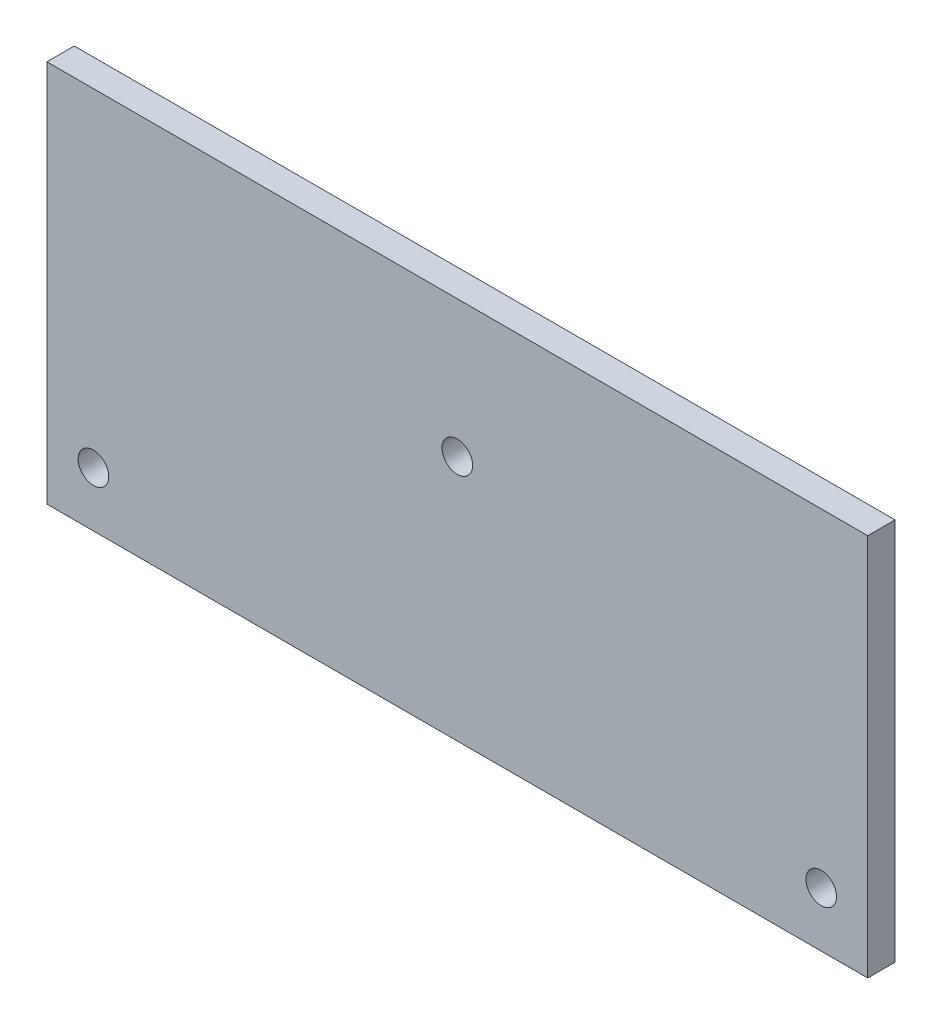
ISO-10303-21;
HEADER;
FILE_DESCRIPTION(('STEP AP214'),'2;1');
FILE_NAME('part.step','',(''),(''),'','','');
FILE_SCHEMA(('AUTOMOTIVE_DESIGN { 1 0 10303 214 1 1 1 1 }'));
ENDSEC;
DATA;
#1=APPLICATION_CONTEXT('core data for automotive mechanical design processes');
#2=APPLICATION_PROTOCOL_DEFINITION('international standard','automotive_design',2000,#1);
#3=PRODUCT_CONTEXT('',#1,'mechanical');
#4=PRODUCT('Part','Part','',(#3));
#5=PRODUCT_RELATED_PRODUCT_CATEGORY('part','',(#4));
#6=PRODUCT_DEFINITION_FORMATION('','',#4);
#7=PRODUCT_DEFINITION_CONTEXT('part definition',#1,'design');
#8=PRODUCT_DEFINITION('design','',#6,#7);
#9=PRODUCT_DEFINITION_SHAPE('','',#8);
#10=(LENGTH_UNIT() NAMED_UNIT(*) SI_UNIT(.MILLI.,.METRE.));
#11=(NAMED_UNIT(*) PLANE_ANGLE_UNIT() SI_UNIT($,.RADIAN.));
#12=(NAMED_UNIT(*) SI_UNIT($,.STERADIAN.) SOLID_ANGLE_UNIT());
#13=UNCERTAINTY_MEASURE_WITH_UNIT(LENGTH_MEASURE(1.E-05),#10,'distance_accuracy_value','');
#14=(GEOMETRIC_REPRESENTATION_CONTEXT(3) GLOBAL_UNCERTAINTY_ASSIGNED_CONTEXT((#13)) GLOBAL_UNIT_ASSIGNED_CONTEXT((#10,
#11,#12)) REPRESENTATION_CONTEXT('',''));
#15=CARTESIAN_POINT('',(0.,0.,0.));
#16=DIRECTION('',(0.,0.,1.));
#17=DIRECTION('',(1.,0.,0.));
#18=AXIS2_PLACEMENT_3D('',#15,#16,#17);
#19=CARTESIAN_POINT('',(0.,0.,5.));
#20=DIRECTION('',(0.,0.,1.));
#21=DIRECTION('',(1.,0.,0.));
#22=AXIS2_PLACEMENT_3D('',#19,#20,#21);
#23=PLANE('',#22);
#24=CARTESIAN_POINT('',(8.50000000000001,-60.,5.));
#25=DIRECTION('',(0.,0.,1.));
#26=DIRECTION('',(1.,0.,0.));
#27=AXIS2_PLACEMENT_3D('',#24,#25,#26);
#28=CIRCLE('',#27,2.8);
#29=CARTESIAN_POINT('',(11.3,-60.,5.));
#30=VERTEX_POINT('',#29);
#31=EDGE_CURVE('E134',#30,#30,#28,.T.);
#32=ORIENTED_EDGE('',*,*,#31,.F.);
#33=EDGE_LOOP('',(#32));
#34=FACE_BOUND('',#33,.T.);
#35=DIRECTION('',(0.,-1.,0.));
#36=VECTOR('',#35,1.);
#37=CARTESIAN_POINT('',(0.,0.,5.));
#38=LINE('',#37,#36);
#39=CARTESIAN_POINT('',(0.,0.,5.));
#40=VERTEX_POINT('',#39);
#41=CARTESIAN_POINT('',(0.,-70.,5.));
#42=VERTEX_POINT('',#41);
#43=EDGE_CURVE('E92',#40,#42,#38,.T.);
#44=ORIENTED_EDGE('',*,*,#43,.T.);
#45=DIRECTION('',(1.,0.,0.));
#46=VECTOR('',#45,1.);
#47=CARTESIAN_POINT('',(0.,-70.,5.));
#48=LINE('',#47,#46);
#49=CARTESIAN_POINT('',(150.,-70.,5.));
#50=VERTEX_POINT('',#49);
#51=EDGE_CURVE('E87',#42,#50,#48,.T.);
#52=ORIENTED_EDGE('',*,*,#51,.T.);
#53=DIRECTION('',(0.,1.,0.));
#54=VECTOR('',#53,1.);
#55=CARTESIAN_POINT('',(150.,0.,5.));
#56=LINE('',#55,#54);
#57=CARTESIAN_POINT('',(150.,0.,5.));
#58=VERTEX_POINT('',#57);
#59=EDGE_CURVE('E90',#50,#58,#56,.T.);
#60=ORIENTED_EDGE('',*,*,#59,.T.);
#61=DIRECTION('',(-1.,0.,0.));
#62=VECTOR('',#61,1.);
#63=CARTESIAN_POINT('',(0.,0.,5.));
#64=LINE('',#63,#62);
#65=EDGE_CURVE('E57',#58,#40,#64,.T.);
#66=ORIENTED_EDGE('',*,*,#65,.T.);
#67=EDGE_LOOP('',(#44,#52,#60,#66));
#68=FACE_BOUND('',#67,.T.);
#69=CARTESIAN_POINT('',(75.,-25.,5.));
#70=DIRECTION('',(0.,0.,1.));
#71=DIRECTION('',(1.,0.,0.));
#72=AXIS2_PLACEMENT_3D('',#69,#70,#71);
#73=CIRCLE('',#72,2.80000000000001);
#74=CARTESIAN_POINT('',(77.8,-25.,5.));
#75=VERTEX_POINT('',#74);
#76=EDGE_CURVE('E112',#75,#75,#73,.T.);
#77=ORIENTED_EDGE('',*,*,#76,.F.);
#78=EDGE_LOOP('',(#77));
#79=FACE_BOUND('',#78,.T.);
#80=CARTESIAN_POINT('',(141.5,-60.,5.));
#81=DIRECTION('',(0.,0.,1.));
#82=DIRECTION('',(1.,0.,0.));
#83=AXIS2_PLACEMENT_3D('',#80,#81,#82);
#84=CIRCLE('',#83,2.8);
#85=CARTESIAN_POINT('',(144.3,-60.,5.));
#86=VERTEX_POINT('',#85);
#87=EDGE_CURVE('E142',#86,#86,#84,.T.);
#88=ORIENTED_EDGE('',*,*,#87,.F.);
#89=EDGE_LOOP('',(#88));
#90=FACE_BOUND('',#89,.T.);
#91=ADVANCED_FACE('F39',(#34,#68,#79,#90),#23,.T.);
#92=CARTESIAN_POINT('',(0.,0.,0.));
#93=DIRECTION('',(0.,0.,1.));
#94=DIRECTION('',(1.,0.,0.));
#95=AXIS2_PLACEMENT_3D('',#92,#93,#94);
#96=PLANE('',#95);
#97=DIRECTION('',(0.,-1.,0.));
#98=VECTOR('',#97,1.);
#99=CARTESIAN_POINT('',(0.,0.,0.));
#100=LINE('',#99,#98);
#101=CARTESIAN_POINT('',(0.,0.,0.));
#102=VERTEX_POINT('',#101);
#103=CARTESIAN_POINT('',(0.,-70.,0.));
#104=VERTEX_POINT('',#103);
#105=EDGE_CURVE('E108',#102,#104,#100,.T.);
#106=ORIENTED_EDGE('',*,*,#105,.F.);
#107=DIRECTION('',(-1.,0.,0.));
#108=VECTOR('',#107,1.);
#109=CARTESIAN_POINT('',(0.,0.,0.));
#110=LINE('',#109,#108);
#111=CARTESIAN_POINT('',(150.,0.,0.));
#112=VERTEX_POINT('',#111);
#113=EDGE_CURVE('E80',#112,#102,#110,.T.);
#114=ORIENTED_EDGE('',*,*,#113,.F.);
#115=DIRECTION('',(0.,1.,0.));
#116=VECTOR('',#115,1.);
#117=CARTESIAN_POINT('',(150.,0.,0.));
#118=LINE('',#117,#116);
#119=CARTESIAN_POINT('',(150.,-70.,0.));
#120=VERTEX_POINT('',#119);
#121=EDGE_CURVE('E74',#120,#112,#118,.T.);
#122=ORIENTED_EDGE('',*,*,#121,.F.);
#123=DIRECTION('',(1.,0.,0.));
#124=VECTOR('',#123,1.);
#125=CARTESIAN_POINT('',(0.,-70.,0.));
#126=LINE('',#125,#124);
#127=EDGE_CURVE('E97',#104,#120,#126,.T.);
#128=ORIENTED_EDGE('',*,*,#127,.F.);
#129=EDGE_LOOP('',(#106,#114,#122,#128));
#130=FACE_BOUND('',#129,.T.);
#131=CARTESIAN_POINT('',(75.,-25.,0.));
#132=DIRECTION('',(0.,0.,1.));
#133=DIRECTION('',(1.,0.,0.));
#134=AXIS2_PLACEMENT_3D('',#131,#132,#133);
#135=CIRCLE('',#134,2.80000000000001);
#136=CARTESIAN_POINT('',(77.8,-25.,0.));
#137=VERTEX_POINT('',#136);
#138=EDGE_CURVE('E130',#137,#137,#135,.T.);
#139=ORIENTED_EDGE('',*,*,#138,.T.);
#140=EDGE_LOOP('',(#139));
#141=FACE_BOUND('',#140,.T.);
#142=CARTESIAN_POINT('',(8.50000000000001,-60.,0.));
#143=DIRECTION('',(0.,0.,1.));
#144=DIRECTION('',(1.,0.,0.));
#145=AXIS2_PLACEMENT_3D('',#142,#143,#144);
#146=CIRCLE('',#145,2.8);
#147=CARTESIAN_POINT('',(11.3,-60.,0.));
#148=VERTEX_POINT('',#147);
#149=EDGE_CURVE('E138',#148,#148,#146,.T.);
#150=ORIENTED_EDGE('',*,*,#149,.T.);
#151=EDGE_LOOP('',(#150));
#152=FACE_BOUND('',#151,.T.);
#153=CARTESIAN_POINT('',(141.5,-60.,0.));
#154=DIRECTION('',(0.,0.,1.));
#155=DIRECTION('',(1.,0.,0.));
#156=AXIS2_PLACEMENT_3D('',#153,#154,#155);
#157=CIRCLE('',#156,2.8);
#158=CARTESIAN_POINT('',(144.3,-60.,0.));
#159=VERTEX_POINT('',#158);
#160=EDGE_CURVE('E146',#159,#159,#157,.T.);
#161=ORIENTED_EDGE('',*,*,#160,.T.);
#162=EDGE_LOOP('',(#161));
#163=FACE_BOUND('',#162,.T.);
#164=ADVANCED_FACE('F125',(#130,#141,#152,#163),#96,.F.);
#165=CARTESIAN_POINT('',(0.,0.,5.));
#166=DIRECTION('',(1.,0.,0.));
#167=DIRECTION('',(0.,1.,0.));
#168=AXIS2_PLACEMENT_3D('',#165,#166,#167);
#169=PLANE('',#168);
#170=ORIENTED_EDGE('',*,*,#105,.T.);
#171=DIRECTION('',(0.,0.,-1.));
#172=VECTOR('',#171,1.);
#173=CARTESIAN_POINT('',(0.,-70.,5.));
#174=LINE('',#173,#172);
#175=EDGE_CURVE('E11',#42,#104,#174,.T.);
#176=ORIENTED_EDGE('',*,*,#175,.F.);
#177=ORIENTED_EDGE('',*,*,#43,.F.);
#178=DIRECTION('',(0.,0.,-1.));
#179=VECTOR('',#178,1.);
#180=CARTESIAN_POINT('',(0.,0.,5.));
#181=LINE('',#180,#179);
#182=EDGE_CURVE('E104',#40,#102,#181,.T.);
#183=ORIENTED_EDGE('',*,*,#182,.T.);
#184=EDGE_LOOP('',(#170,#176,#177,#183));
#185=FACE_BOUND('',#184,.T.);
#186=ADVANCED_FACE('F41',(#185),#169,.F.);
#187=CARTESIAN_POINT('',(0.,-70.,5.));
#188=DIRECTION('',(0.,1.,0.));
#189=DIRECTION('',(0.,0.,1.));
#190=AXIS2_PLACEMENT_3D('',#187,#188,#189);
#191=PLANE('',#190);
#192=ORIENTED_EDGE('',*,*,#127,.T.);
#193=DIRECTION('',(0.,0.,-1.));
#194=VECTOR('',#193,1.);
#195=CARTESIAN_POINT('',(150.,-70.,5.));
#196=LINE('',#195,#194);
#197=EDGE_CURVE('E49',#50,#120,#196,.T.);
#198=ORIENTED_EDGE('',*,*,#197,.F.);
#199=ORIENTED_EDGE('',*,*,#51,.F.);
#200=ORIENTED_EDGE('',*,*,#175,.T.);
#201=EDGE_LOOP('',(#192,#198,#199,#200));
#202=FACE_BOUND('',#201,.T.);
#203=ADVANCED_FACE('F96',(#202),#191,.F.);
#204=CARTESIAN_POINT('',(150.,0.,5.));
#205=DIRECTION('',(-1.,0.,0.));
#206=DIRECTION('',(0.,0.,1.));
#207=AXIS2_PLACEMENT_3D('',#204,#205,#206);
#208=PLANE('',#207);
#209=ORIENTED_EDGE('',*,*,#121,.T.);
#210=DIRECTION('',(0.,0.,-1.));
#211=VECTOR('',#210,1.);
#212=CARTESIAN_POINT('',(150.,0.,5.));
#213=LINE('',#212,#211);
#214=EDGE_CURVE('E99',#58,#112,#213,.T.);
#215=ORIENTED_EDGE('',*,*,#214,.F.);
#216=ORIENTED_EDGE('',*,*,#59,.F.);
#217=ORIENTED_EDGE('',*,*,#197,.T.);
#218=EDGE_LOOP('',(#209,#215,#216,#217));
#219=FACE_BOUND('',#218,.T.);
#220=ADVANCED_FACE('F100',(#219),#208,.F.);
#221=CARTESIAN_POINT('',(0.,0.,5.));
#222=DIRECTION('',(0.,-1.,0.));
#223=DIRECTION('',(0.,0.,-1.));
#224=AXIS2_PLACEMENT_3D('',#221,#222,#223);
#225=PLANE('',#224);
#226=ORIENTED_EDGE('',*,*,#113,.T.);
#227=ORIENTED_EDGE('',*,*,#182,.F.);
#228=ORIENTED_EDGE('',*,*,#65,.F.);
#229=ORIENTED_EDGE('',*,*,#214,.T.);
#230=EDGE_LOOP('',(#226,#227,#228,#229));
#231=FACE_BOUND('',#230,.T.);
#232=ADVANCED_FACE('F122',(#231),#225,.F.);
#233=CARTESIAN_POINT('',(75.,-25.,5.));
#234=DIRECTION('',(0.,0.,-1.));
#235=DIRECTION('',(-1.,0.,0.));
#236=AXIS2_PLACEMENT_3D('',#233,#234,#235);
#237=CYLINDRICAL_SURFACE('',#236,2.80000000000001);
#238=ORIENTED_EDGE('',*,*,#76,.T.);
#239=EDGE_LOOP('',(#238));
#240=FACE_BOUND('',#239,.T.);
#241=ORIENTED_EDGE('',*,*,#138,.F.);
#242=EDGE_LOOP('',(#241));
#243=FACE_BOUND('',#242,.T.);
#244=ADVANCED_FACE('F166',(#240,#243),#237,.F.);
#245=CARTESIAN_POINT('',(8.50000000000001,-60.,5.));
#246=DIRECTION('',(0.,0.,-1.));
#247=DIRECTION('',(-1.,0.,0.));
#248=AXIS2_PLACEMENT_3D('',#245,#246,#247);
#249=CYLINDRICAL_SURFACE('',#248,2.8);
#250=ORIENTED_EDGE('',*,*,#31,.T.);
#251=EDGE_LOOP('',(#250));
#252=FACE_BOUND('',#251,.T.);
#253=ORIENTED_EDGE('',*,*,#149,.F.);
#254=EDGE_LOOP('',(#253));
#255=FACE_BOUND('',#254,.T.);
#256=ADVANCED_FACE('F212',(#252,#255),#249,.F.);
#257=CARTESIAN_POINT('',(141.5,-60.,5.));
#258=DIRECTION('',(0.,0.,-1.));
#259=DIRECTION('',(-1.,0.,0.));
#260=AXIS2_PLACEMENT_3D('',#257,#258,#259);
#261=CYLINDRICAL_SURFACE('',#260,2.8);
#262=ORIENTED_EDGE('',*,*,#87,.T.);
#263=EDGE_LOOP('',(#262));
#264=FACE_BOUND('',#263,.T.);
#265=ORIENTED_EDGE('',*,*,#160,.F.);
#266=EDGE_LOOP('',(#265));
#267=FACE_BOUND('',#266,.T.);
#268=ADVANCED_FACE('F154',(#264,#267),#261,.F.);
#269=CLOSED_SHELL('',(#91,#164,#186,#203,#220,#232,#244,#256,#268));
#270=MANIFOLD_SOLID_BREP('B2',#269);
#271=ADVANCED_BREP_SHAPE_REPRESENTATION('',(#18,#270),#14);
#272=SHAPE_DEFINITION_REPRESENTATION(#9,#271);
ENDSEC;
END-ISO-10303-21;
